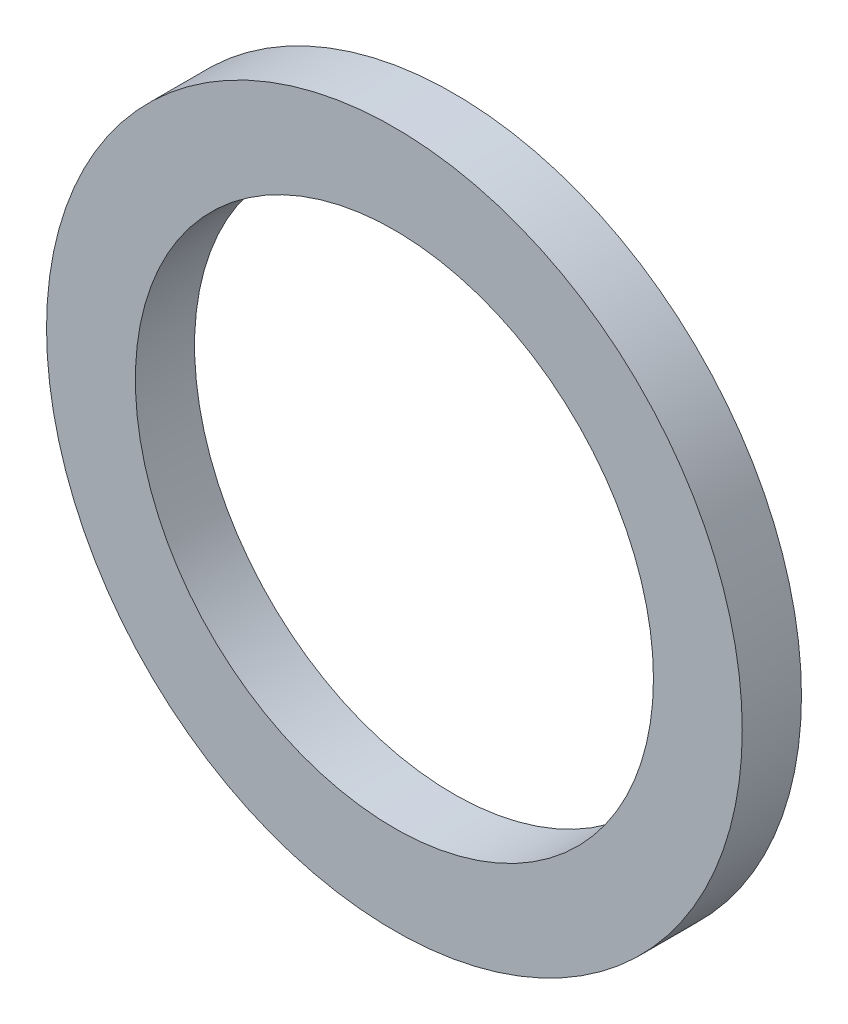
ISO-10303-21;
HEADER;
FILE_DESCRIPTION(('STEP AP214'),'2;1');
FILE_NAME('part.step','',(''),(''),'','','');
FILE_SCHEMA(('AUTOMOTIVE_DESIGN { 1 0 10303 214 1 1 1 1 }'));
ENDSEC;
DATA;
#1=APPLICATION_CONTEXT('core data for automotive mechanical design processes');
#2=APPLICATION_PROTOCOL_DEFINITION('international standard','automotive_design',2000,#1);
#3=PRODUCT_CONTEXT('',#1,'mechanical');
#4=PRODUCT('Part','Part','',(#3));
#5=PRODUCT_RELATED_PRODUCT_CATEGORY('part','',(#4));
#6=PRODUCT_DEFINITION_FORMATION('','',#4);
#7=PRODUCT_DEFINITION_CONTEXT('part definition',#1,'design');
#8=PRODUCT_DEFINITION('design','',#6,#7);
#9=PRODUCT_DEFINITION_SHAPE('','',#8);
#10=(LENGTH_UNIT() NAMED_UNIT(*) SI_UNIT(.MILLI.,.METRE.));
#11=(NAMED_UNIT(*) PLANE_ANGLE_UNIT() SI_UNIT($,.RADIAN.));
#12=(NAMED_UNIT(*) SI_UNIT($,.STERADIAN.) SOLID_ANGLE_UNIT());
#13=UNCERTAINTY_MEASURE_WITH_UNIT(LENGTH_MEASURE(1.E-05),#10,'distance_accuracy_value','');
#14=(GEOMETRIC_REPRESENTATION_CONTEXT(3) GLOBAL_UNCERTAINTY_ASSIGNED_CONTEXT((#13)) GLOBAL_UNIT_ASSIGNED_CONTEXT((#10,
#11,#12)) REPRESENTATION_CONTEXT('',''));
#15=CARTESIAN_POINT('',(0.,0.,0.));
#16=DIRECTION('',(0.,0.,1.));
#17=DIRECTION('',(1.,0.,0.));
#18=AXIS2_PLACEMENT_3D('',#15,#16,#17);
#19=CARTESIAN_POINT('',(0.,0.,400.));
#20=DIRECTION('',(0.,0.,1.));
#21=DIRECTION('',(1.,0.,0.));
#22=AXIS2_PLACEMENT_3D('',#19,#20,#21);
#23=PLANE('',#22);
#24=CARTESIAN_POINT('',(0.,0.,400.));
#25=DIRECTION('',(0.,0.,1.));
#26=DIRECTION('',(1.,0.,0.));
#27=AXIS2_PLACEMENT_3D('',#24,#25,#26);
#28=CIRCLE('',#27,4700.);
#29=CARTESIAN_POINT('',(4700.,0.,400.));
#30=VERTEX_POINT('',#29);
#31=EDGE_CURVE('E10',#30,#30,#28,.T.);
#32=ORIENTED_EDGE('',*,*,#31,.T.);
#33=EDGE_LOOP('',(#32));
#34=FACE_BOUND('',#33,.T.);
#35=CARTESIAN_POINT('',(0.,0.,400.));
#36=DIRECTION('',(0.,0.,1.));
#37=DIRECTION('',(1.,0.,0.));
#38=AXIS2_PLACEMENT_3D('',#35,#36,#37);
#39=CIRCLE('',#38,3500.);
#40=CARTESIAN_POINT('',(3500.,0.,400.));
#41=VERTEX_POINT('',#40);
#42=EDGE_CURVE('E45',#41,#41,#39,.T.);
#43=ORIENTED_EDGE('',*,*,#42,.F.);
#44=EDGE_LOOP('',(#43));
#45=FACE_BOUND('',#44,.T.);
#46=ADVANCED_FACE('F34',(#34,#45),#23,.T.);
#47=CARTESIAN_POINT('',(0.,0.,-400.));
#48=DIRECTION('',(0.,0.,1.));
#49=DIRECTION('',(1.,0.,0.));
#50=AXIS2_PLACEMENT_3D('',#47,#48,#49);
#51=PLANE('',#50);
#52=CARTESIAN_POINT('',(0.,0.,-400.));
#53=DIRECTION('',(0.,0.,1.));
#54=DIRECTION('',(1.,0.,0.));
#55=AXIS2_PLACEMENT_3D('',#52,#53,#54);
#56=CIRCLE('',#55,4700.);
#57=CARTESIAN_POINT('',(4700.,0.,-400.));
#58=VERTEX_POINT('',#57);
#59=EDGE_CURVE('E38',#58,#58,#56,.T.);
#60=ORIENTED_EDGE('',*,*,#59,.F.);
#61=EDGE_LOOP('',(#60));
#62=FACE_BOUND('',#61,.T.);
#63=CARTESIAN_POINT('',(0.,0.,-400.));
#64=DIRECTION('',(0.,0.,1.));
#65=DIRECTION('',(1.,0.,0.));
#66=AXIS2_PLACEMENT_3D('',#63,#64,#65);
#67=CIRCLE('',#66,3500.);
#68=CARTESIAN_POINT('',(3500.,0.,-400.));
#69=VERTEX_POINT('',#68);
#70=EDGE_CURVE('E47',#69,#69,#67,.T.);
#71=ORIENTED_EDGE('',*,*,#70,.T.);
#72=EDGE_LOOP('',(#71));
#73=FACE_BOUND('',#72,.T.);
#74=ADVANCED_FACE('F57',(#62,#73),#51,.F.);
#75=CARTESIAN_POINT('',(0.,0.,400.));
#76=DIRECTION('',(0.,0.,-1.));
#77=DIRECTION('',(-1.,0.,0.));
#78=AXIS2_PLACEMENT_3D('',#75,#76,#77);
#79=CYLINDRICAL_SURFACE('',#78,4700.);
#80=ORIENTED_EDGE('',*,*,#31,.F.);
#81=EDGE_LOOP('',(#80));
#82=FACE_BOUND('',#81,.T.);
#83=ORIENTED_EDGE('',*,*,#59,.T.);
#84=EDGE_LOOP('',(#83));
#85=FACE_BOUND('',#84,.T.);
#86=ADVANCED_FACE('F36',(#82,#85),#79,.T.);
#87=CARTESIAN_POINT('',(0.,0.,400.));
#88=DIRECTION('',(0.,0.,-1.));
#89=DIRECTION('',(-1.,0.,0.));
#90=AXIS2_PLACEMENT_3D('',#87,#88,#89);
#91=CYLINDRICAL_SURFACE('',#90,3500.);
#92=ORIENTED_EDGE('',*,*,#42,.T.);
#93=EDGE_LOOP('',(#92));
#94=FACE_BOUND('',#93,.T.);
#95=ORIENTED_EDGE('',*,*,#70,.F.);
#96=EDGE_LOOP('',(#95));
#97=FACE_BOUND('',#96,.T.);
#98=ADVANCED_FACE('F53',(#94,#97),#91,.F.);
#99=CLOSED_SHELL('',(#46,#74,#86,#98));
#100=MANIFOLD_SOLID_BREP('B2',#99);
#101=ADVANCED_BREP_SHAPE_REPRESENTATION('',(#18,#100),#14);
#102=SHAPE_DEFINITION_REPRESENTATION(#9,#101);
ENDSEC;
END-ISO-10303-21;
